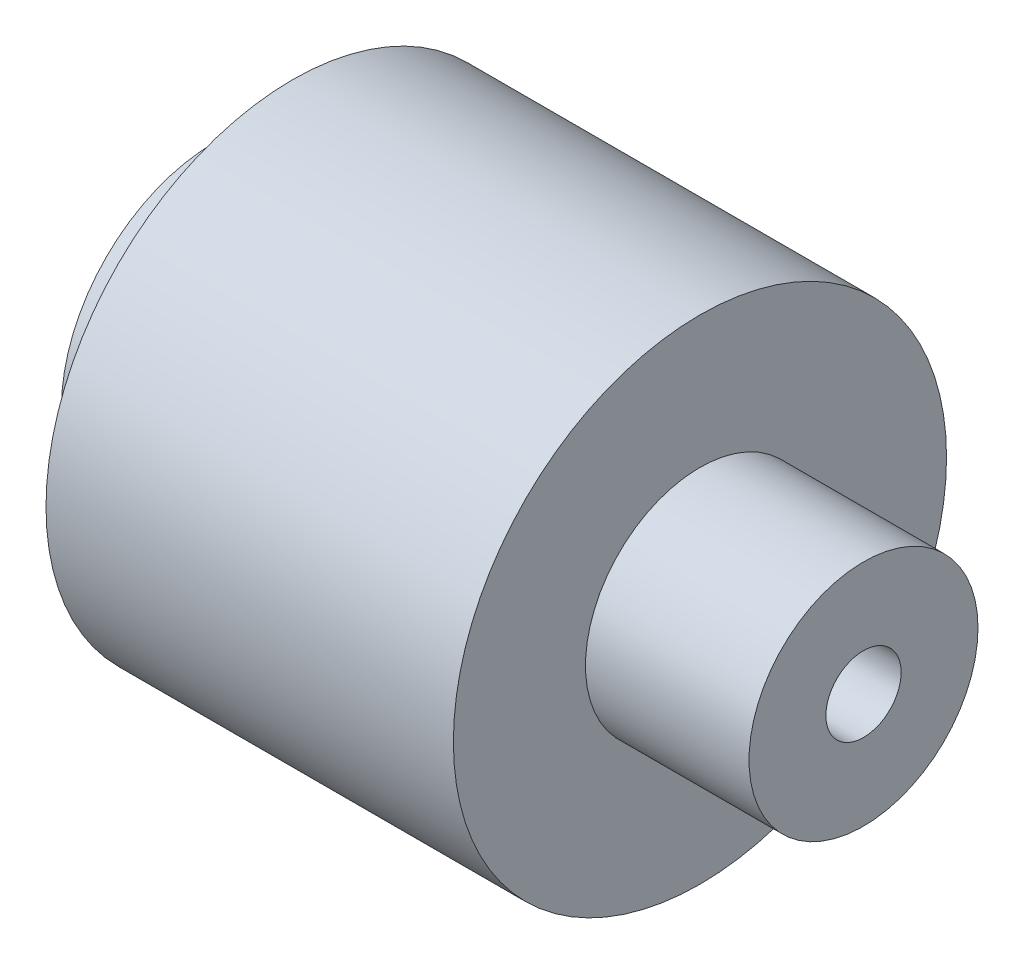
ISO-10303-21;
HEADER;
FILE_DESCRIPTION(('STEP AP214'),'2;1');
FILE_NAME('part.step','',(''),(''),'','','');
FILE_SCHEMA(('AUTOMOTIVE_DESIGN { 1 0 10303 214 1 1 1 1 }'));
ENDSEC;
DATA;
#1=APPLICATION_CONTEXT('core data for automotive mechanical design processes');
#2=APPLICATION_PROTOCOL_DEFINITION('international standard','automotive_design',2000,#1);
#3=PRODUCT_CONTEXT('',#1,'mechanical');
#4=PRODUCT('Part','Part','',(#3));
#5=PRODUCT_RELATED_PRODUCT_CATEGORY('part','',(#4));
#6=PRODUCT_DEFINITION_FORMATION('','',#4);
#7=PRODUCT_DEFINITION_CONTEXT('part definition',#1,'design');
#8=PRODUCT_DEFINITION('design','',#6,#7);
#9=PRODUCT_DEFINITION_SHAPE('','',#8);
#10=(LENGTH_UNIT() NAMED_UNIT(*) SI_UNIT(.MILLI.,.METRE.));
#11=(NAMED_UNIT(*) PLANE_ANGLE_UNIT() SI_UNIT($,.RADIAN.));
#12=(NAMED_UNIT(*) SI_UNIT($,.STERADIAN.) SOLID_ANGLE_UNIT());
#13=UNCERTAINTY_MEASURE_WITH_UNIT(LENGTH_MEASURE(1.E-05),#10,'distance_accuracy_value','');
#14=(GEOMETRIC_REPRESENTATION_CONTEXT(3) GLOBAL_UNCERTAINTY_ASSIGNED_CONTEXT((#13)) GLOBAL_UNIT_ASSIGNED_CONTEXT((#10,
#11,#12)) REPRESENTATION_CONTEXT('',''));
#15=CARTESIAN_POINT('',(0.,0.,0.));
#16=DIRECTION('',(0.,0.,1.));
#17=DIRECTION('',(1.,0.,0.));
#18=AXIS2_PLACEMENT_3D('',#15,#16,#17);
#19=CARTESIAN_POINT('',(34.9071592,0.,0.));
#20=DIRECTION('',(-1.,0.,0.));
#21=DIRECTION('',(0.,0.,1.));
#22=AXIS2_PLACEMENT_3D('',#19,#20,#21);
#23=CYLINDRICAL_SURFACE('',#22,15.07617);
#24=CARTESIAN_POINT('',(0.,0.,0.));
#25=DIRECTION('',(1.,0.,0.));
#26=DIRECTION('',(0.,0.,-1.));
#27=AXIS2_PLACEMENT_3D('',#24,#25,#26);
#28=CIRCLE('',#27,15.07617);
#29=CARTESIAN_POINT('',(0.,0.,-15.07617));
#30=VERTEX_POINT('',#29);
#31=EDGE_CURVE('E85',#30,#30,#28,.T.);
#32=ORIENTED_EDGE('',*,*,#31,.T.);
#33=EDGE_LOOP('',(#32));
#34=FACE_BOUND('',#33,.T.);
#35=CARTESIAN_POINT('',(24.9071592,0.,0.));
#36=DIRECTION('',(1.,0.,0.));
#37=DIRECTION('',(0.,0.,-1.));
#38=AXIS2_PLACEMENT_3D('',#35,#36,#37);
#39=CIRCLE('',#38,15.07617);
#40=CARTESIAN_POINT('',(24.9071592,0.,-15.07617));
#41=VERTEX_POINT('',#40);
#42=EDGE_CURVE('E65',#41,#41,#39,.T.);
#43=ORIENTED_EDGE('',*,*,#42,.F.);
#44=EDGE_LOOP('',(#43));
#45=FACE_BOUND('',#44,.T.);
#46=ADVANCED_FACE('F33',(#34,#45),#23,.T.);
#47=CARTESIAN_POINT('',(0.,0.,0.));
#48=DIRECTION('',(1.,0.,0.));
#49=DIRECTION('',(0.,0.,-1.));
#50=AXIS2_PLACEMENT_3D('',#47,#48,#49);
#51=PLANE('',#50);
#52=CARTESIAN_POINT('',(0.,0.,0.));
#53=DIRECTION('',(1.,0.,0.));
#54=DIRECTION('',(0.,0.,-1.));
#55=AXIS2_PLACEMENT_3D('',#52,#53,#54);
#56=CIRCLE('',#55,9.3853);
#57=CARTESIAN_POINT('',(0.,0.,-9.3853));
#58=VERTEX_POINT('',#57);
#59=EDGE_CURVE('E40',#58,#58,#56,.F.);
#60=ORIENTED_EDGE('',*,*,#59,.F.);
#61=EDGE_LOOP('',(#60));
#62=FACE_BOUND('',#61,.T.);
#63=ORIENTED_EDGE('',*,*,#31,.F.);
#64=EDGE_LOOP('',(#63));
#65=FACE_BOUND('',#64,.T.);
#66=ADVANCED_FACE('F92',(#62,#65),#51,.F.);
#67=CARTESIAN_POINT('',(-4.7498,0.,0.));
#68=DIRECTION('',(-1.,0.,0.));
#69=DIRECTION('',(0.,0.,1.));
#70=AXIS2_PLACEMENT_3D('',#67,#68,#69);
#71=PLANE('',#70);
#72=CARTESIAN_POINT('',(-4.7498,0.,0.));
#73=DIRECTION('',(-1.,0.,0.));
#74=DIRECTION('',(0.,0.,1.));
#75=AXIS2_PLACEMENT_3D('',#72,#73,#74);
#76=CIRCLE('',#75,9.3853);
#77=CARTESIAN_POINT('',(-4.7498,0.,9.3853));
#78=VERTEX_POINT('',#77);
#79=EDGE_CURVE('E80',#78,#78,#76,.T.);
#80=ORIENTED_EDGE('',*,*,#79,.T.);
#81=EDGE_LOOP('',(#80));
#82=FACE_BOUND('',#81,.T.);
#83=CARTESIAN_POINT('',(-4.7498,0.,0.));
#84=DIRECTION('',(-1.,0.,0.));
#85=DIRECTION('',(0.,0.,1.));
#86=AXIS2_PLACEMENT_3D('',#83,#84,#85);
#87=CIRCLE('',#86,4.5847);
#88=CARTESIAN_POINT('',(-4.7498,0.,4.5847));
#89=VERTEX_POINT('',#88);
#90=EDGE_CURVE('E77',#89,#89,#87,.T.);
#91=ORIENTED_EDGE('',*,*,#90,.F.);
#92=EDGE_LOOP('',(#91));
#93=FACE_BOUND('',#92,.T.);
#94=ADVANCED_FACE('F95',(#82,#93),#71,.T.);
#95=CARTESIAN_POINT('',(-4.7498,0.,0.));
#96=DIRECTION('',(1.,0.,0.));
#97=DIRECTION('',(0.,0.,-1.));
#98=AXIS2_PLACEMENT_3D('',#95,#96,#97);
#99=CYLINDRICAL_SURFACE('',#98,9.3853);
#100=ORIENTED_EDGE('',*,*,#79,.F.);
#101=EDGE_LOOP('',(#100));
#102=FACE_BOUND('',#101,.T.);
#103=ORIENTED_EDGE('',*,*,#59,.T.);
#104=EDGE_LOOP('',(#103));
#105=FACE_BOUND('',#104,.T.);
#106=ADVANCED_FACE('F90',(#102,#105),#99,.T.);
#107=CARTESIAN_POINT('',(-4.7498,0.,0.));
#108=DIRECTION('',(1.,0.,0.));
#109=DIRECTION('',(0.,0.,-1.));
#110=AXIS2_PLACEMENT_3D('',#107,#108,#109);
#111=CYLINDRICAL_SURFACE('',#110,4.5847);
#112=ORIENTED_EDGE('',*,*,#90,.T.);
#113=EDGE_LOOP('',(#112));
#114=FACE_BOUND('',#113,.T.);
#115=CARTESIAN_POINT('',(0.,0.,0.));
#116=DIRECTION('',(-1.,0.,0.));
#117=DIRECTION('',(0.,0.,1.));
#118=AXIS2_PLACEMENT_3D('',#115,#116,#117);
#119=CIRCLE('',#118,4.5847);
#120=CARTESIAN_POINT('',(0.,0.,4.5847));
#121=VERTEX_POINT('',#120);
#122=EDGE_CURVE('E71',#121,#121,#119,.T.);
#123=ORIENTED_EDGE('',*,*,#122,.F.);
#124=EDGE_LOOP('',(#123));
#125=FACE_BOUND('',#124,.T.);
#126=ADVANCED_FACE('F143',(#114,#125),#111,.F.);
#127=ORIENTED_EDGE('',*,*,#122,.T.);
#128=EDGE_LOOP('',(#127));
#129=FACE_BOUND('',#128,.T.);
#130=ADVANCED_FACE('F96',(#129),#51,.F.);
#131=CARTESIAN_POINT('',(24.9071592,0.,0.));
#132=DIRECTION('',(1.,0.,0.));
#133=DIRECTION('',(0.,0.,-1.));
#134=AXIS2_PLACEMENT_3D('',#131,#132,#133);
#135=PLANE('',#134);
#136=CARTESIAN_POINT('',(24.9071592,0.,0.));
#137=DIRECTION('',(1.,0.,0.));
#138=DIRECTION('',(0.,0.,-1.));
#139=AXIS2_PLACEMENT_3D('',#136,#137,#138);
#140=CIRCLE('',#139,7.);
#141=CARTESIAN_POINT('',(24.9071592,0.,-7.));
#142=VERTEX_POINT('',#141);
#143=EDGE_CURVE('E104',#142,#142,#140,.T.);
#144=ORIENTED_EDGE('',*,*,#143,.F.);
#145=EDGE_LOOP('',(#144));
#146=FACE_BOUND('',#145,.T.);
#147=ORIENTED_EDGE('',*,*,#42,.T.);
#148=EDGE_LOOP('',(#147));
#149=FACE_BOUND('',#148,.T.);
#150=ADVANCED_FACE('F125',(#146,#149),#135,.T.);
#151=CARTESIAN_POINT('',(24.9071592,0.,0.));
#152=DIRECTION('',(1.,0.,0.));
#153=DIRECTION('',(0.,0.,-1.));
#154=AXIS2_PLACEMENT_3D('',#151,#152,#153);
#155=CYLINDRICAL_SURFACE('',#154,7.);
#156=ORIENTED_EDGE('',*,*,#143,.T.);
#157=EDGE_LOOP('',(#156));
#158=FACE_BOUND('',#157,.T.);
#159=CARTESIAN_POINT('',(34.9071592,0.,0.));
#160=DIRECTION('',(1.,0.,0.));
#161=DIRECTION('',(0.,0.,-1.));
#162=AXIS2_PLACEMENT_3D('',#159,#160,#161);
#163=CIRCLE('',#162,7.);
#164=CARTESIAN_POINT('',(34.9071592,0.,-7.));
#165=VERTEX_POINT('',#164);
#166=EDGE_CURVE('E107',#165,#165,#163,.T.);
#167=ORIENTED_EDGE('',*,*,#166,.F.);
#168=EDGE_LOOP('',(#167));
#169=FACE_BOUND('',#168,.T.);
#170=ADVANCED_FACE('F122',(#158,#169),#155,.T.);
#171=CARTESIAN_POINT('',(8.9071592,0.,0.));
#172=DIRECTION('',(1.,0.,0.));
#173=DIRECTION('',(0.,0.,-1.));
#174=AXIS2_PLACEMENT_3D('',#171,#172,#173);
#175=PLANE('',#174);
#176=CARTESIAN_POINT('',(8.9071592,0.,0.));
#177=DIRECTION('',(1.,0.,0.));
#178=DIRECTION('',(0.,0.,-1.));
#179=AXIS2_PLACEMENT_3D('',#176,#177,#178);
#180=CIRCLE('',#179,2.3);
#181=CARTESIAN_POINT('',(8.9071592,1.46266024763101,1.775));
#182=VERTEX_POINT('',#181);
#183=CARTESIAN_POINT('',(8.9071592,1.46266024763101,-1.775));
#184=VERTEX_POINT('',#183);
#185=EDGE_CURVE('E73',#182,#184,#180,.T.);
#186=ORIENTED_EDGE('',*,*,#185,.T.);
#187=DIRECTION('',(0.,0.,1.));
#188=VECTOR('',#187,1.);
#189=CARTESIAN_POINT('',(8.9071592,1.46266024763101,1.775));
#190=LINE('',#189,#188);
#191=EDGE_CURVE('E69',#184,#182,#190,.T.);
#192=ORIENTED_EDGE('',*,*,#191,.T.);
#193=EDGE_LOOP('',(#186,#192));
#194=FACE_BOUND('',#193,.T.);
#195=ADVANCED_FACE('F124',(#194),#175,.T.);
#196=CARTESIAN_POINT('',(8.9071592,1.46266024763101,1.775));
#197=DIRECTION('',(0.,1.,0.));
#198=DIRECTION('',(0.,0.,1.));
#199=AXIS2_PLACEMENT_3D('',#196,#197,#198);
#200=PLANE('',#199);
#201=DIRECTION('',(0.,0.,-1.));
#202=VECTOR('',#201,1.);
#203=CARTESIAN_POINT('',(32.3071592,1.46266024763101,1.775));
#204=LINE('',#203,#202);
#205=CARTESIAN_POINT('',(32.3071592,1.46266024763101,1.775));
#206=VERTEX_POINT('',#205);
#207=CARTESIAN_POINT('',(32.3071592,1.46266024763101,-1.775));
#208=VERTEX_POINT('',#207);
#209=EDGE_CURVE('E11',#206,#208,#204,.T.);
#210=ORIENTED_EDGE('',*,*,#209,.F.);
#211=DIRECTION('',(1.,0.,0.));
#212=VECTOR('',#211,1.);
#213=CARTESIAN_POINT('',(8.9071592,1.46266024763101,1.775));
#214=LINE('',#213,#212);
#215=EDGE_CURVE('E52',#182,#206,#214,.T.);
#216=ORIENTED_EDGE('',*,*,#215,.F.);
#217=ORIENTED_EDGE('',*,*,#191,.F.);
#218=DIRECTION('',(1.,0.,0.));
#219=VECTOR('',#218,1.);
#220=CARTESIAN_POINT('',(8.9071592,1.46266024763101,-1.775));
#221=LINE('',#220,#219);
#222=EDGE_CURVE('E62',#184,#208,#221,.T.);
#223=ORIENTED_EDGE('',*,*,#222,.T.);
#224=EDGE_LOOP('',(#210,#216,#217,#223));
#225=FACE_BOUND('',#224,.T.);
#226=ADVANCED_FACE('F67',(#225),#200,.F.);
#227=CARTESIAN_POINT('',(32.3071592,0.,0.));
#228=DIRECTION('',(1.,0.,0.));
#229=DIRECTION('',(0.,0.,-1.));
#230=AXIS2_PLACEMENT_3D('',#227,#228,#229);
#231=PLANE('',#230);
#232=ORIENTED_EDGE('',*,*,#209,.T.);
#233=CARTESIAN_POINT('',(32.3071592,0.,0.));
#234=DIRECTION('',(1.,0.,0.));
#235=DIRECTION('',(0.,0.,-1.));
#236=AXIS2_PLACEMENT_3D('',#233,#234,#235);
#237=CIRCLE('',#236,2.3);
#238=EDGE_CURVE('E45',#208,#206,#237,.T.);
#239=ORIENTED_EDGE('',*,*,#238,.T.);
#240=EDGE_LOOP('',(#232,#239));
#241=FACE_BOUND('',#240,.T.);
#242=ADVANCED_FACE('F58',(#241),#231,.T.);
#243=CARTESIAN_POINT('',(8.9071592,0.,0.));
#244=DIRECTION('',(1.,0.,0.));
#245=DIRECTION('',(0.,0.,-1.));
#246=AXIS2_PLACEMENT_3D('',#243,#244,#245);
#247=CYLINDRICAL_SURFACE('',#246,2.3);
#248=CARTESIAN_POINT('',(34.9071592,0.,0.));
#249=DIRECTION('',(1.,0.,0.));
#250=DIRECTION('',(0.,0.,-1.));
#251=AXIS2_PLACEMENT_3D('',#248,#249,#250);
#252=CIRCLE('',#251,2.3);
#253=CARTESIAN_POINT('',(34.9071592,0.,-2.3));
#254=VERTEX_POINT('',#253);
#255=EDGE_CURVE('E64',#254,#254,#252,.T.);
#256=ORIENTED_EDGE('',*,*,#255,.T.);
#257=EDGE_LOOP('',(#256));
#258=FACE_BOUND('',#257,.T.);
#259=ORIENTED_EDGE('',*,*,#238,.F.);
#260=ORIENTED_EDGE('',*,*,#222,.F.);
#261=ORIENTED_EDGE('',*,*,#185,.F.);
#262=ORIENTED_EDGE('',*,*,#215,.T.);
#263=EDGE_LOOP('',(#259,#260,#261,#262));
#264=FACE_BOUND('',#263,.T.);
#265=ADVANCED_FACE('F61',(#258,#264),#247,.F.);
#266=CARTESIAN_POINT('',(34.9071592,0.,0.));
#267=DIRECTION('',(1.,0.,0.));
#268=DIRECTION('',(0.,0.,-1.));
#269=AXIS2_PLACEMENT_3D('',#266,#267,#268);
#270=PLANE('',#269);
#271=ORIENTED_EDGE('',*,*,#255,.F.);
#272=EDGE_LOOP('',(#271));
#273=FACE_BOUND('',#272,.T.);
#274=ORIENTED_EDGE('',*,*,#166,.T.);
#275=EDGE_LOOP('',(#274));
#276=FACE_BOUND('',#275,.T.);
#277=ADVANCED_FACE('F115',(#273,#276),#270,.T.);
#278=CLOSED_SHELL('',(#46,#66,#94,#106,#126,#130,#150,#170,#195,#226,#242,#265,#277));
#279=MANIFOLD_SOLID_BREP('B2',#278);
#280=ADVANCED_BREP_SHAPE_REPRESENTATION('',(#18,#279),#14);
#281=SHAPE_DEFINITION_REPRESENTATION(#9,#280);
ENDSEC;
END-ISO-10303-21;
